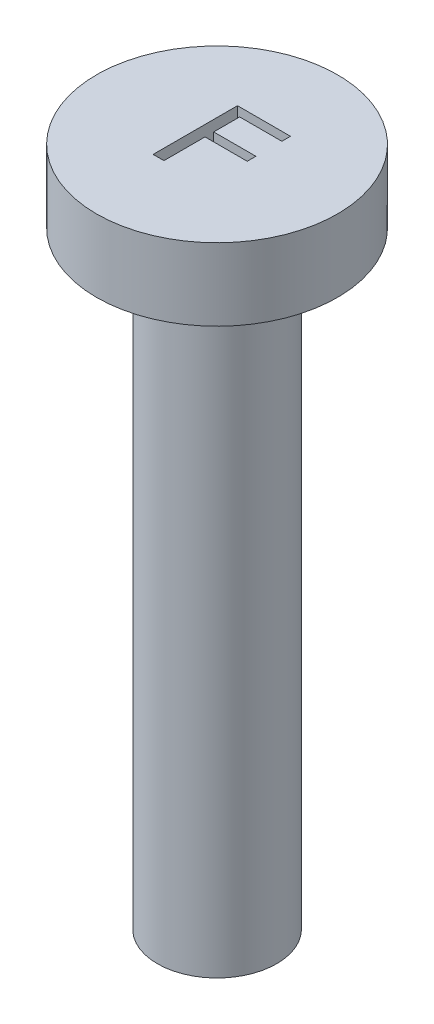
ISO-10303-21;
HEADER;
FILE_DESCRIPTION(('STEP AP214'),'2;1');
FILE_NAME('part.step','',(''),(''),'','','');
FILE_SCHEMA(('AUTOMOTIVE_DESIGN { 1 0 10303 214 1 1 1 1 }'));
ENDSEC;
DATA;
#1=APPLICATION_CONTEXT('core data for automotive mechanical design processes');
#2=APPLICATION_PROTOCOL_DEFINITION('international standard','automotive_design',2000,#1);
#3=PRODUCT_CONTEXT('',#1,'mechanical');
#4=PRODUCT('Part','Part','',(#3));
#5=PRODUCT_RELATED_PRODUCT_CATEGORY('part','',(#4));
#6=PRODUCT_DEFINITION_FORMATION('','',#4);
#7=PRODUCT_DEFINITION_CONTEXT('part definition',#1,'design');
#8=PRODUCT_DEFINITION('design','',#6,#7);
#9=PRODUCT_DEFINITION_SHAPE('','',#8);
#10=(LENGTH_UNIT() NAMED_UNIT(*) SI_UNIT(.MILLI.,.METRE.));
#11=(NAMED_UNIT(*) PLANE_ANGLE_UNIT() SI_UNIT($,.RADIAN.));
#12=(NAMED_UNIT(*) SI_UNIT($,.STERADIAN.) SOLID_ANGLE_UNIT());
#13=UNCERTAINTY_MEASURE_WITH_UNIT(LENGTH_MEASURE(1.E-05),#10,'distance_accuracy_value','');
#14=(GEOMETRIC_REPRESENTATION_CONTEXT(3) GLOBAL_UNCERTAINTY_ASSIGNED_CONTEXT((#13)) GLOBAL_UNIT_ASSIGNED_CONTEXT((#10,
#11,#12)) REPRESENTATION_CONTEXT('',''));
#15=CARTESIAN_POINT('',(0.,0.,0.));
#16=DIRECTION('',(0.,0.,1.));
#17=DIRECTION('',(1.,0.,0.));
#18=AXIS2_PLACEMENT_3D('',#15,#16,#17);
#19=CARTESIAN_POINT('',(0.,28.2,0.));
#20=DIRECTION('',(0.,1.,0.));
#21=DIRECTION('',(0.,0.,1.));
#22=AXIS2_PLACEMENT_3D('',#19,#20,#21);
#23=PLANE('',#22);
#24=CARTESIAN_POINT('',(0.,28.2,0.));
#25=DIRECTION('',(0.,1.,0.));
#26=DIRECTION('',(0.,0.,1.));
#27=AXIS2_PLACEMENT_3D('',#24,#25,#26);
#28=CIRCLE('',#27,5.);
#29=CARTESIAN_POINT('',(0.,28.2,5.));
#30=VERTEX_POINT('',#29);
#31=EDGE_CURVE('E153',#30,#30,#28,.T.);
#32=ORIENTED_EDGE('',*,*,#31,.T.);
#33=EDGE_LOOP('',(#32));
#34=FACE_BOUND('',#33,.T.);
#35=DIRECTION('',(-1.,0.,0.));
#36=VECTOR('',#35,1.);
#37=CARTESIAN_POINT('',(-0.516025641025641,28.2,1.68704888593484));
#38=LINE('',#37,#36);
#39=CARTESIAN_POINT('',(-0.516025641025641,28.2,1.68704888593484));
#40=VERTEX_POINT('',#39);
#41=CARTESIAN_POINT('',(-0.96474358974359,28.2,1.68704888593484));
#42=VERTEX_POINT('',#41);
#43=EDGE_CURVE('E135',#40,#42,#38,.T.);
#44=ORIENTED_EDGE('',*,*,#43,.T.);
#45=DIRECTION('',(0.,0.,-1.));
#46=VECTOR('',#45,1.);
#47=CARTESIAN_POINT('',(-0.96474358974359,28.2,1.68704888593484));
#48=LINE('',#47,#46);
#49=CARTESIAN_POINT('',(-0.96474358974359,28.2,-1.81295111406516));
#50=VERTEX_POINT('',#49);
#51=EDGE_CURVE('E57',#42,#50,#48,.T.);
#52=ORIENTED_EDGE('',*,*,#51,.T.);
#53=DIRECTION('',(1.,0.,0.));
#54=VECTOR('',#53,1.);
#55=CARTESIAN_POINT('',(-0.96474358974359,28.2,-1.81295111406516));
#56=LINE('',#55,#54);
#57=CARTESIAN_POINT('',(1.23397435897436,28.2,-1.81295111406516));
#58=VERTEX_POINT('',#57);
#59=EDGE_CURVE('E139',#50,#58,#56,.T.);
#60=ORIENTED_EDGE('',*,*,#59,.T.);
#61=DIRECTION('',(0.,0.,1.));
#62=VECTOR('',#61,1.);
#63=CARTESIAN_POINT('',(1.23397435897436,28.2,-1.81295111406516));
#64=LINE('',#63,#62);
#65=CARTESIAN_POINT('',(1.23397435897436,28.2,-1.4539767550908));
#66=VERTEX_POINT('',#65);
#67=EDGE_CURVE('E418',#58,#66,#64,.T.);
#68=ORIENTED_EDGE('',*,*,#67,.T.);
#69=DIRECTION('',(-1.,0.,0.));
#70=VECTOR('',#69,1.);
#71=CARTESIAN_POINT('',(1.23397435897436,28.2,-1.4539767550908));
#72=LINE('',#71,#70);
#73=CARTESIAN_POINT('',(-0.516025641025641,28.2,-1.4539767550908));
#74=VERTEX_POINT('',#73);
#75=EDGE_CURVE('E420',#66,#74,#72,.T.);
#76=ORIENTED_EDGE('',*,*,#75,.T.);
#77=DIRECTION('',(0.,0.,1.));
#78=VECTOR('',#77,1.);
#79=CARTESIAN_POINT('',(-0.516025641025641,28.2,-1.4539767550908));
#80=LINE('',#79,#78);
#81=CARTESIAN_POINT('',(-0.516025641025641,28.2,-0.377053678167722));
#82=VERTEX_POINT('',#81);
#83=EDGE_CURVE('E424',#74,#82,#80,.T.);
#84=ORIENTED_EDGE('',*,*,#83,.T.);
#85=DIRECTION('',(1.,0.,0.));
#86=VECTOR('',#85,1.);
#87=CARTESIAN_POINT('',(-0.516025641025641,28.2,-0.377053678167722));
#88=LINE('',#87,#86);
#89=CARTESIAN_POINT('',(1.23397435897436,28.2,-0.377053678167722));
#90=VERTEX_POINT('',#89);
#91=EDGE_CURVE('E431',#82,#90,#88,.T.);
#92=ORIENTED_EDGE('',*,*,#91,.T.);
#93=DIRECTION('',(0.,0.,1.));
#94=VECTOR('',#93,1.);
#95=CARTESIAN_POINT('',(1.23397435897436,28.2,-0.377053678167722));
#96=LINE('',#95,#94);
#97=CARTESIAN_POINT('',(1.23397435897436,28.2,-0.0180793191933632));
#98=VERTEX_POINT('',#97);
#99=EDGE_CURVE('E398',#90,#98,#96,.T.);
#100=ORIENTED_EDGE('',*,*,#99,.T.);
#101=DIRECTION('',(-1.,0.,0.));
#102=VECTOR('',#101,1.);
#103=CARTESIAN_POINT('',(1.23397435897436,28.2,-0.0180793191933632));
#104=LINE('',#103,#102);
#105=CARTESIAN_POINT('',(-0.516025641025641,28.2,-0.0180793191933632));
#106=VERTEX_POINT('',#105);
#107=EDGE_CURVE('E395',#98,#106,#104,.T.);
#108=ORIENTED_EDGE('',*,*,#107,.T.);
#109=DIRECTION('',(0.,0.,1.));
#110=VECTOR('',#109,1.);
#111=CARTESIAN_POINT('',(-0.516025641025641,28.2,-0.0180793191933632));
#112=LINE('',#111,#110);
#113=EDGE_CURVE('E389',#106,#40,#112,.T.);
#114=ORIENTED_EDGE('',*,*,#113,.T.);
#115=EDGE_LOOP('',(#44,#52,#60,#68,#76,#84,#92,#100,#108,#114));
#116=FACE_BOUND('',#115,.T.);
#117=ADVANCED_FACE('F42',(#34,#116),#23,.T.);
#118=CARTESIAN_POINT('',(0.,25.2,0.));
#119=DIRECTION('',(0.,-1.,0.));
#120=DIRECTION('',(0.,0.,-1.));
#121=AXIS2_PLACEMENT_3D('',#118,#119,#120);
#122=CYLINDRICAL_SURFACE('',#121,2.475);
#123=CARTESIAN_POINT('',(0.,25.2,0.));
#124=DIRECTION('',(0.,1.,0.));
#125=DIRECTION('',(0.,0.,1.));
#126=AXIS2_PLACEMENT_3D('',#123,#124,#125);
#127=CIRCLE('',#126,2.475);
#128=CARTESIAN_POINT('',(0.,25.2,2.475));
#129=VERTEX_POINT('',#128);
#130=EDGE_CURVE('E11',#129,#129,#127,.T.);
#131=ORIENTED_EDGE('',*,*,#130,.F.);
#132=EDGE_LOOP('',(#131));
#133=FACE_BOUND('',#132,.T.);
#134=CARTESIAN_POINT('',(0.,0.,0.));
#135=DIRECTION('',(0.,1.,0.));
#136=DIRECTION('',(0.,0.,1.));
#137=AXIS2_PLACEMENT_3D('',#134,#135,#136);
#138=CIRCLE('',#137,2.475);
#139=CARTESIAN_POINT('',(0.,0.,2.475));
#140=VERTEX_POINT('',#139);
#141=EDGE_CURVE('E46',#140,#140,#138,.T.);
#142=ORIENTED_EDGE('',*,*,#141,.T.);
#143=EDGE_LOOP('',(#142));
#144=FACE_BOUND('',#143,.T.);
#145=ADVANCED_FACE('F44',(#133,#144),#122,.T.);
#146=CARTESIAN_POINT('',(0.,0.,0.));
#147=DIRECTION('',(0.,1.,0.));
#148=DIRECTION('',(0.,0.,1.));
#149=AXIS2_PLACEMENT_3D('',#146,#147,#148);
#150=PLANE('',#149);
#151=CARTESIAN_POINT('',(0.,0.,0.));
#152=DIRECTION('',(0.,-1.,0.));
#153=DIRECTION('',(0.,0.,-1.));
#154=AXIS2_PLACEMENT_3D('',#151,#152,#153);
#155=CIRCLE('',#154,1.02499999999999);
#156=CARTESIAN_POINT('',(0.,0.,-1.02499999999999));
#157=VERTEX_POINT('',#156);
#158=EDGE_CURVE('E140',#157,#157,#155,.T.);
#159=ORIENTED_EDGE('',*,*,#158,.F.);
#160=EDGE_LOOP('',(#159));
#161=FACE_BOUND('',#160,.T.);
#162=ORIENTED_EDGE('',*,*,#141,.F.);
#163=EDGE_LOOP('',(#162));
#164=FACE_BOUND('',#163,.T.);
#165=ADVANCED_FACE('F172',(#161,#164),#150,.F.);
#166=CARTESIAN_POINT('',(0.,28.2,0.));
#167=DIRECTION('',(0.,-1.,0.));
#168=DIRECTION('',(0.,0.,-1.));
#169=AXIS2_PLACEMENT_3D('',#166,#167,#168);
#170=CYLINDRICAL_SURFACE('',#169,5.);
#171=ORIENTED_EDGE('',*,*,#31,.F.);
#172=EDGE_LOOP('',(#171));
#173=FACE_BOUND('',#172,.T.);
#174=CARTESIAN_POINT('',(0.,25.2,0.));
#175=DIRECTION('',(0.,1.,0.));
#176=DIRECTION('',(0.,0.,1.));
#177=AXIS2_PLACEMENT_3D('',#174,#175,#176);
#178=CIRCLE('',#177,5.);
#179=CARTESIAN_POINT('',(0.,25.2,5.));
#180=VERTEX_POINT('',#179);
#181=EDGE_CURVE('E152',#180,#180,#178,.T.);
#182=ORIENTED_EDGE('',*,*,#181,.T.);
#183=EDGE_LOOP('',(#182));
#184=FACE_BOUND('',#183,.T.);
#185=ADVANCED_FACE('F159',(#173,#184),#170,.T.);
#186=CARTESIAN_POINT('',(0.,25.2,0.));
#187=DIRECTION('',(0.,1.,0.));
#188=DIRECTION('',(0.,0.,1.));
#189=AXIS2_PLACEMENT_3D('',#186,#187,#188);
#190=PLANE('',#189);
#191=ORIENTED_EDGE('',*,*,#130,.T.);
#192=EDGE_LOOP('',(#191));
#193=FACE_BOUND('',#192,.T.);
#194=ORIENTED_EDGE('',*,*,#181,.F.);
#195=EDGE_LOOP('',(#194));
#196=FACE_BOUND('',#195,.T.);
#197=ADVANCED_FACE('F161',(#193,#196),#190,.F.);
#198=CARTESIAN_POINT('',(0.,7.25,0.));
#199=DIRECTION('',(0.,-1.,0.));
#200=DIRECTION('',(0.,0.,-1.));
#201=AXIS2_PLACEMENT_3D('',#198,#199,#200);
#202=CONICAL_SURFACE('',#201,1.025,1.02974425867665);
#203=CARTESIAN_POINT('',(0.,7.86588213450325,0.));
#204=VERTEX_POINT('',#203);
#205=VERTEX_LOOP('',#204);
#206=FACE_BOUND('',#205,.T.);
#207=CARTESIAN_POINT('',(0.,7.25,0.));
#208=DIRECTION('',(0.,-1.,0.));
#209=DIRECTION('',(0.,0.,-1.));
#210=AXIS2_PLACEMENT_3D('',#207,#208,#209);
#211=CIRCLE('',#210,1.025);
#212=CARTESIAN_POINT('',(0.,7.25,-1.025));
#213=VERTEX_POINT('',#212);
#214=EDGE_CURVE('E144',#213,#213,#211,.T.);
#215=ORIENTED_EDGE('',*,*,#214,.T.);
#216=EDGE_LOOP('',(#215));
#217=FACE_BOUND('',#216,.T.);
#218=ADVANCED_FACE('F163',(#206,#217),#202,.F.);
#219=CARTESIAN_POINT('',(0.,0.,0.));
#220=DIRECTION('',(0.,-1.,0.));
#221=DIRECTION('',(0.,0.,-1.));
#222=AXIS2_PLACEMENT_3D('',#219,#220,#221);
#223=CYLINDRICAL_SURFACE('',#222,1.02499999999999);
#224=ORIENTED_EDGE('',*,*,#214,.F.);
#225=EDGE_LOOP('',(#224));
#226=FACE_BOUND('',#225,.T.);
#227=ORIENTED_EDGE('',*,*,#158,.T.);
#228=EDGE_LOOP('',(#227));
#229=FACE_BOUND('',#228,.T.);
#230=ADVANCED_FACE('F170',(#226,#229),#223,.F.);
#231=CARTESIAN_POINT('',(-0.96474358974359,27.2,1.68704888593484));
#232=DIRECTION('',(1.,0.,0.));
#233=DIRECTION('',(0.,0.,-1.));
#234=AXIS2_PLACEMENT_3D('',#231,#232,#233);
#235=PLANE('',#234);
#236=ORIENTED_EDGE('',*,*,#51,.F.);
#237=DIRECTION('',(0.,1.,0.));
#238=VECTOR('',#237,1.);
#239=CARTESIAN_POINT('',(-0.96474358974359,27.2,1.68704888593484));
#240=LINE('',#239,#238);
#241=CARTESIAN_POINT('',(-0.96474358974359,27.2,1.68704888593484));
#242=VERTEX_POINT('',#241);
#243=EDGE_CURVE('E134',#242,#42,#240,.T.);
#244=ORIENTED_EDGE('',*,*,#243,.F.);
#245=DIRECTION('',(0.,0.,-1.));
#246=VECTOR('',#245,1.);
#247=CARTESIAN_POINT('',(-0.96474358974359,27.2,1.68704888593484));
#248=LINE('',#247,#246);
#249=CARTESIAN_POINT('',(-0.96474358974359,27.2,-1.81295111406516));
#250=VERTEX_POINT('',#249);
#251=EDGE_CURVE('E125',#242,#250,#248,.T.);
#252=ORIENTED_EDGE('',*,*,#251,.T.);
#253=DIRECTION('',(0.,1.,0.));
#254=VECTOR('',#253,1.);
#255=CARTESIAN_POINT('',(-0.96474358974359,27.2,-1.81295111406516));
#256=LINE('',#255,#254);
#257=EDGE_CURVE('E133',#250,#50,#256,.T.);
#258=ORIENTED_EDGE('',*,*,#257,.T.);
#259=EDGE_LOOP('',(#236,#244,#252,#258));
#260=FACE_BOUND('',#259,.T.);
#261=ADVANCED_FACE('F132',(#260),#235,.T.);
#262=CARTESIAN_POINT('',(-0.96474358974359,27.2,-1.81295111406516));
#263=DIRECTION('',(0.,0.,1.));
#264=DIRECTION('',(1.,0.,0.));
#265=AXIS2_PLACEMENT_3D('',#262,#263,#264);
#266=PLANE('',#265);
#267=ORIENTED_EDGE('',*,*,#59,.F.);
#268=ORIENTED_EDGE('',*,*,#257,.F.);
#269=DIRECTION('',(1.,0.,0.));
#270=VECTOR('',#269,1.);
#271=CARTESIAN_POINT('',(-0.96474358974359,27.2,-1.81295111406516));
#272=LINE('',#271,#270);
#273=CARTESIAN_POINT('',(1.23397435897436,27.2,-1.81295111406516));
#274=VERTEX_POINT('',#273);
#275=EDGE_CURVE('E121',#250,#274,#272,.T.);
#276=ORIENTED_EDGE('',*,*,#275,.T.);
#277=DIRECTION('',(0.,1.,0.));
#278=VECTOR('',#277,1.);
#279=CARTESIAN_POINT('',(1.23397435897436,27.2,-1.81295111406516));
#280=LINE('',#279,#278);
#281=EDGE_CURVE('E141',#274,#58,#280,.T.);
#282=ORIENTED_EDGE('',*,*,#281,.T.);
#283=EDGE_LOOP('',(#267,#268,#276,#282));
#284=FACE_BOUND('',#283,.T.);
#285=ADVANCED_FACE('F137',(#284),#266,.T.);
#286=CARTESIAN_POINT('',(1.23397435897436,27.2,-1.81295111406516));
#287=DIRECTION('',(-1.,0.,0.));
#288=DIRECTION('',(0.,0.,1.));
#289=AXIS2_PLACEMENT_3D('',#286,#287,#288);
#290=PLANE('',#289);
#291=ORIENTED_EDGE('',*,*,#67,.F.);
#292=ORIENTED_EDGE('',*,*,#281,.F.);
#293=DIRECTION('',(0.,0.,1.));
#294=VECTOR('',#293,1.);
#295=CARTESIAN_POINT('',(1.23397435897436,27.2,-1.81295111406516));
#296=LINE('',#295,#294);
#297=CARTESIAN_POINT('',(1.23397435897436,27.2,-1.4539767550908));
#298=VERTEX_POINT('',#297);
#299=EDGE_CURVE('E127',#274,#298,#296,.T.);
#300=ORIENTED_EDGE('',*,*,#299,.T.);
#301=DIRECTION('',(0.,1.,0.));
#302=VECTOR('',#301,1.);
#303=CARTESIAN_POINT('',(1.23397435897436,27.2,-1.4539767550908));
#304=LINE('',#303,#302);
#305=EDGE_CURVE('E146',#298,#66,#304,.T.);
#306=ORIENTED_EDGE('',*,*,#305,.T.);
#307=EDGE_LOOP('',(#291,#292,#300,#306));
#308=FACE_BOUND('',#307,.T.);
#309=ADVANCED_FACE('F191',(#308),#290,.T.);
#310=CARTESIAN_POINT('',(1.23397435897436,27.2,-1.4539767550908));
#311=DIRECTION('',(0.,0.,-1.));
#312=DIRECTION('',(-1.,0.,0.));
#313=AXIS2_PLACEMENT_3D('',#310,#311,#312);
#314=PLANE('',#313);
#315=ORIENTED_EDGE('',*,*,#75,.F.);
#316=ORIENTED_EDGE('',*,*,#305,.F.);
#317=DIRECTION('',(-1.,0.,0.));
#318=VECTOR('',#317,1.);
#319=CARTESIAN_POINT('',(1.23397435897436,27.2,-1.4539767550908));
#320=LINE('',#319,#318);
#321=CARTESIAN_POINT('',(-0.516025641025641,27.2,-1.4539767550908));
#322=VERTEX_POINT('',#321);
#323=EDGE_CURVE('E452',#298,#322,#320,.T.);
#324=ORIENTED_EDGE('',*,*,#323,.T.);
#325=DIRECTION('',(0.,1.,0.));
#326=VECTOR('',#325,1.);
#327=CARTESIAN_POINT('',(-0.516025641025641,27.2,-1.4539767550908));
#328=LINE('',#327,#326);
#329=EDGE_CURVE('E413',#322,#74,#328,.T.);
#330=ORIENTED_EDGE('',*,*,#329,.T.);
#331=EDGE_LOOP('',(#315,#316,#324,#330));
#332=FACE_BOUND('',#331,.T.);
#333=ADVANCED_FACE('F194',(#332),#314,.T.);
#334=CARTESIAN_POINT('',(-0.516025641025641,27.2,-1.4539767550908));
#335=DIRECTION('',(-1.,0.,0.));
#336=DIRECTION('',(0.,0.,1.));
#337=AXIS2_PLACEMENT_3D('',#334,#335,#336);
#338=PLANE('',#337);
#339=ORIENTED_EDGE('',*,*,#83,.F.);
#340=ORIENTED_EDGE('',*,*,#329,.F.);
#341=DIRECTION('',(0.,0.,1.));
#342=VECTOR('',#341,1.);
#343=CARTESIAN_POINT('',(-0.516025641025641,27.2,-1.4539767550908));
#344=LINE('',#343,#342);
#345=CARTESIAN_POINT('',(-0.516025641025641,27.2,-0.377053678167722));
#346=VERTEX_POINT('',#345);
#347=EDGE_CURVE('E450',#322,#346,#344,.T.);
#348=ORIENTED_EDGE('',*,*,#347,.T.);
#349=DIRECTION('',(0.,1.,0.));
#350=VECTOR('',#349,1.);
#351=CARTESIAN_POINT('',(-0.516025641025641,27.2,-0.377053678167722));
#352=LINE('',#351,#350);
#353=EDGE_CURVE('E411',#346,#82,#352,.T.);
#354=ORIENTED_EDGE('',*,*,#353,.T.);
#355=EDGE_LOOP('',(#339,#340,#348,#354));
#356=FACE_BOUND('',#355,.T.);
#357=ADVANCED_FACE('F198',(#356),#338,.T.);
#358=CARTESIAN_POINT('',(-0.516025641025641,27.2,-0.377053678167722));
#359=DIRECTION('',(0.,0.,1.));
#360=DIRECTION('',(1.,0.,0.));
#361=AXIS2_PLACEMENT_3D('',#358,#359,#360);
#362=PLANE('',#361);
#363=ORIENTED_EDGE('',*,*,#91,.F.);
#364=ORIENTED_EDGE('',*,*,#353,.F.);
#365=DIRECTION('',(1.,0.,0.));
#366=VECTOR('',#365,1.);
#367=CARTESIAN_POINT('',(-0.516025641025641,27.2,-0.377053678167722));
#368=LINE('',#367,#366);
#369=CARTESIAN_POINT('',(1.23397435897436,27.2,-0.377053678167722));
#370=VERTEX_POINT('',#369);
#371=EDGE_CURVE('E448',#346,#370,#368,.T.);
#372=ORIENTED_EDGE('',*,*,#371,.T.);
#373=DIRECTION('',(0.,1.,0.));
#374=VECTOR('',#373,1.);
#375=CARTESIAN_POINT('',(1.23397435897436,27.2,-0.377053678167722));
#376=LINE('',#375,#374);
#377=EDGE_CURVE('E409',#370,#90,#376,.T.);
#378=ORIENTED_EDGE('',*,*,#377,.T.);
#379=EDGE_LOOP('',(#363,#364,#372,#378));
#380=FACE_BOUND('',#379,.T.);
#381=ADVANCED_FACE('F202',(#380),#362,.T.);
#382=CARTESIAN_POINT('',(1.23397435897436,27.2,-0.377053678167722));
#383=DIRECTION('',(-1.,0.,0.));
#384=DIRECTION('',(0.,0.,1.));
#385=AXIS2_PLACEMENT_3D('',#382,#383,#384);
#386=PLANE('',#385);
#387=ORIENTED_EDGE('',*,*,#99,.F.);
#388=ORIENTED_EDGE('',*,*,#377,.F.);
#389=DIRECTION('',(0.,0.,1.));
#390=VECTOR('',#389,1.);
#391=CARTESIAN_POINT('',(1.23397435897436,27.2,-0.377053678167722));
#392=LINE('',#391,#390);
#393=CARTESIAN_POINT('',(1.23397435897436,27.2,-0.0180793191933632));
#394=VERTEX_POINT('',#393);
#395=EDGE_CURVE('E438',#370,#394,#392,.T.);
#396=ORIENTED_EDGE('',*,*,#395,.T.);
#397=DIRECTION('',(0.,1.,0.));
#398=VECTOR('',#397,1.);
#399=CARTESIAN_POINT('',(1.23397435897436,27.2,-0.0180793191933632));
#400=LINE('',#399,#398);
#401=EDGE_CURVE('E407',#394,#98,#400,.T.);
#402=ORIENTED_EDGE('',*,*,#401,.T.);
#403=EDGE_LOOP('',(#387,#388,#396,#402));
#404=FACE_BOUND('',#403,.T.);
#405=ADVANCED_FACE('F206',(#404),#386,.T.);
#406=CARTESIAN_POINT('',(1.23397435897436,27.2,-0.0180793191933632));
#407=DIRECTION('',(0.,0.,-1.));
#408=DIRECTION('',(-1.,0.,0.));
#409=AXIS2_PLACEMENT_3D('',#406,#407,#408);
#410=PLANE('',#409);
#411=ORIENTED_EDGE('',*,*,#107,.F.);
#412=ORIENTED_EDGE('',*,*,#401,.F.);
#413=DIRECTION('',(-1.,0.,0.));
#414=VECTOR('',#413,1.);
#415=CARTESIAN_POINT('',(1.23397435897436,27.2,-0.0180793191933632));
#416=LINE('',#415,#414);
#417=CARTESIAN_POINT('',(-0.516025641025641,27.2,-0.0180793191933632));
#418=VERTEX_POINT('',#417);
#419=EDGE_CURVE('E440',#394,#418,#416,.T.);
#420=ORIENTED_EDGE('',*,*,#419,.T.);
#421=DIRECTION('',(0.,1.,0.));
#422=VECTOR('',#421,1.);
#423=CARTESIAN_POINT('',(-0.516025641025641,27.2,-0.0180793191933632));
#424=LINE('',#423,#422);
#425=EDGE_CURVE('E405',#418,#106,#424,.T.);
#426=ORIENTED_EDGE('',*,*,#425,.T.);
#427=EDGE_LOOP('',(#411,#412,#420,#426));
#428=FACE_BOUND('',#427,.T.);
#429=ADVANCED_FACE('F210',(#428),#410,.T.);
#430=CARTESIAN_POINT('',(-0.516025641025641,27.2,-0.0180793191933632));
#431=DIRECTION('',(-1.,0.,0.));
#432=DIRECTION('',(0.,0.,1.));
#433=AXIS2_PLACEMENT_3D('',#430,#431,#432);
#434=PLANE('',#433);
#435=ORIENTED_EDGE('',*,*,#113,.F.);
#436=ORIENTED_EDGE('',*,*,#425,.F.);
#437=DIRECTION('',(0.,0.,1.));
#438=VECTOR('',#437,1.);
#439=CARTESIAN_POINT('',(-0.516025641025641,27.2,-0.0180793191933632));
#440=LINE('',#439,#438);
#441=CARTESIAN_POINT('',(-0.516025641025641,27.2,1.68704888593484));
#442=VERTEX_POINT('',#441);
#443=EDGE_CURVE('E442',#418,#442,#440,.T.);
#444=ORIENTED_EDGE('',*,*,#443,.T.);
#445=DIRECTION('',(0.,1.,0.));
#446=VECTOR('',#445,1.);
#447=CARTESIAN_POINT('',(-0.516025641025641,27.2,1.68704888593484));
#448=LINE('',#447,#446);
#449=EDGE_CURVE('E388',#442,#40,#448,.T.);
#450=ORIENTED_EDGE('',*,*,#449,.T.);
#451=EDGE_LOOP('',(#435,#436,#444,#450));
#452=FACE_BOUND('',#451,.T.);
#453=ADVANCED_FACE('F214',(#452),#434,.T.);
#454=CARTESIAN_POINT('',(-0.516025641025641,27.2,1.68704888593484));
#455=DIRECTION('',(0.,0.,-1.));
#456=DIRECTION('',(-1.,0.,0.));
#457=AXIS2_PLACEMENT_3D('',#454,#455,#456);
#458=PLANE('',#457);
#459=ORIENTED_EDGE('',*,*,#43,.F.);
#460=ORIENTED_EDGE('',*,*,#449,.F.);
#461=DIRECTION('',(-1.,0.,0.));
#462=VECTOR('',#461,1.);
#463=CARTESIAN_POINT('',(-0.516025641025641,27.2,1.68704888593484));
#464=LINE('',#463,#462);
#465=EDGE_CURVE('E403',#442,#242,#464,.T.);
#466=ORIENTED_EDGE('',*,*,#465,.T.);
#467=ORIENTED_EDGE('',*,*,#243,.T.);
#468=EDGE_LOOP('',(#459,#460,#466,#467));
#469=FACE_BOUND('',#468,.T.);
#470=ADVANCED_FACE('F218',(#469),#458,.T.);
#471=CARTESIAN_POINT('',(0.,27.2,0.));
#472=DIRECTION('',(0.,-1.,0.));
#473=DIRECTION('',(0.,0.,-1.));
#474=AXIS2_PLACEMENT_3D('',#471,#472,#473);
#475=PLANE('',#474);
#476=ORIENTED_EDGE('',*,*,#251,.F.);
#477=ORIENTED_EDGE('',*,*,#465,.F.);
#478=ORIENTED_EDGE('',*,*,#443,.F.);
#479=ORIENTED_EDGE('',*,*,#419,.F.);
#480=ORIENTED_EDGE('',*,*,#395,.F.);
#481=ORIENTED_EDGE('',*,*,#371,.F.);
#482=ORIENTED_EDGE('',*,*,#347,.F.);
#483=ORIENTED_EDGE('',*,*,#323,.F.);
#484=ORIENTED_EDGE('',*,*,#299,.F.);
#485=ORIENTED_EDGE('',*,*,#275,.F.);
#486=EDGE_LOOP('',(#476,#477,#478,#479,#480,#481,#482,#483,#484,#485));
#487=FACE_BOUND('',#486,.T.);
#488=ADVANCED_FACE('F123',(#487),#475,.F.);
#489=CLOSED_SHELL('',(#117,#145,#165,#185,#197,#218,#230,#261,#285,#309,#333,#357,#381,#405,
#429,#453,#470,#488));
#490=MANIFOLD_SOLID_BREP('B2',#489);
#491=ADVANCED_BREP_SHAPE_REPRESENTATION('',(#18,#490),#14);
#492=SHAPE_DEFINITION_REPRESENTATION(#9,#491);
ENDSEC;
END-ISO-10303-21;
